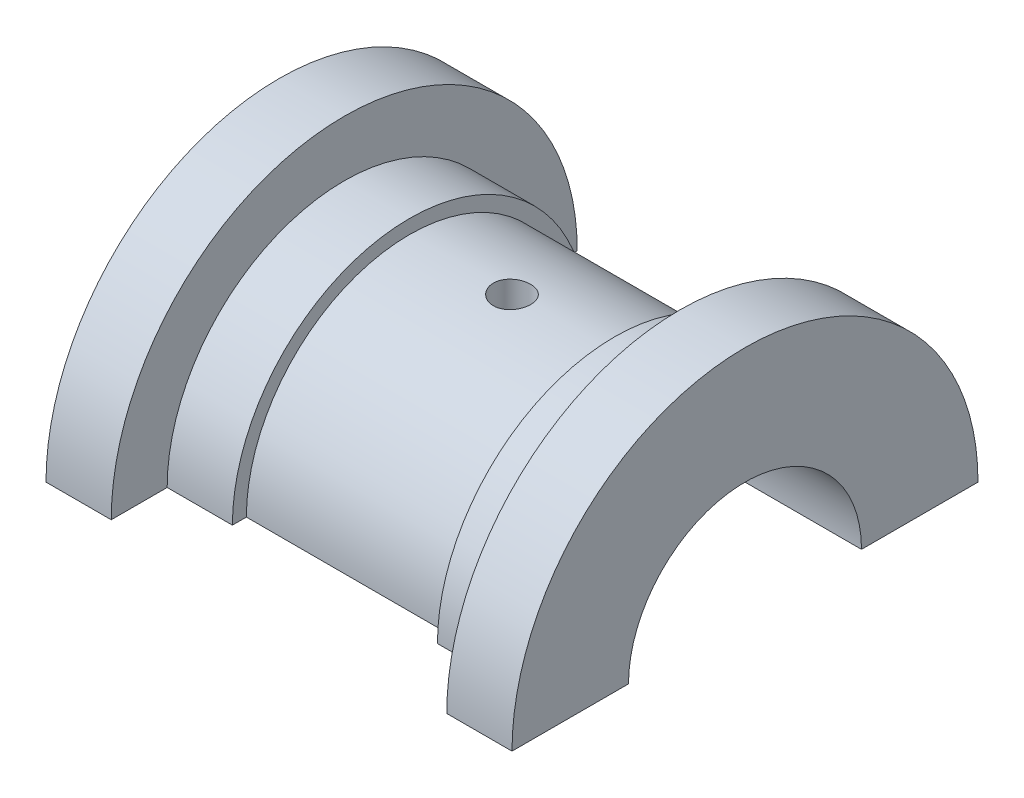
ISO-10303-21;
HEADER;
FILE_DESCRIPTION(('STEP AP214'),'2;1');
FILE_NAME('part.step','',(''),(''),'','','');
FILE_SCHEMA(('AUTOMOTIVE_DESIGN { 1 0 10303 214 1 1 1 1 }'));
ENDSEC;
DATA;
#1=APPLICATION_CONTEXT('core data for automotive mechanical design processes');
#2=APPLICATION_PROTOCOL_DEFINITION('international standard','automotive_design',2000,#1);
#3=PRODUCT_CONTEXT('',#1,'mechanical');
#4=PRODUCT('Part','Part','',(#3));
#5=PRODUCT_RELATED_PRODUCT_CATEGORY('part','',(#4));
#6=PRODUCT_DEFINITION_FORMATION('','',#4);
#7=PRODUCT_DEFINITION_CONTEXT('part definition',#1,'design');
#8=PRODUCT_DEFINITION('design','',#6,#7);
#9=PRODUCT_DEFINITION_SHAPE('','',#8);
#10=(LENGTH_UNIT() NAMED_UNIT(*) SI_UNIT(.MILLI.,.METRE.));
#11=(NAMED_UNIT(*) PLANE_ANGLE_UNIT() SI_UNIT($,.RADIAN.));
#12=(NAMED_UNIT(*) SI_UNIT($,.STERADIAN.) SOLID_ANGLE_UNIT());
#13=UNCERTAINTY_MEASURE_WITH_UNIT(LENGTH_MEASURE(1.E-05),#10,'distance_accuracy_value','');
#14=(GEOMETRIC_REPRESENTATION_CONTEXT(3) GLOBAL_UNCERTAINTY_ASSIGNED_CONTEXT((#13)) GLOBAL_UNIT_ASSIGNED_CONTEXT((#10,
#11,#12)) REPRESENTATION_CONTEXT('',''));
#15=CARTESIAN_POINT('',(0.,0.,0.));
#16=DIRECTION('',(0.,0.,1.));
#17=DIRECTION('',(1.,0.,0.));
#18=AXIS2_PLACEMENT_3D('',#15,#16,#17);
#19=CARTESIAN_POINT('',(25.,0.,0.));
#20=DIRECTION('',(-1.,0.,0.));
#21=DIRECTION('',(0.,0.,1.));
#22=AXIS2_PLACEMENT_3D('',#19,#20,#21);
#23=PLANE('',#22);
#24=CARTESIAN_POINT('',(25.,0.,0.));
#25=DIRECTION('',(-1.,0.,0.));
#26=DIRECTION('',(0.,0.,1.));
#27=AXIS2_PLACEMENT_3D('',#24,#25,#26);
#28=CIRCLE('',#27,25.);
#29=CARTESIAN_POINT('',(25.,0.,25.));
#30=VERTEX_POINT('',#29);
#31=CARTESIAN_POINT('',(25.,0.,-25.));
#32=VERTEX_POINT('',#31);
#33=EDGE_CURVE('E151',#30,#32,#28,.T.);
#34=ORIENTED_EDGE('',*,*,#33,.F.);
#35=DIRECTION('',(0.,0.,-1.));
#36=VECTOR('',#35,1.);
#37=CARTESIAN_POINT('',(25.,0.,0.));
#38=LINE('',#37,#36);
#39=CARTESIAN_POINT('',(25.,0.,12.5));
#40=VERTEX_POINT('',#39);
#41=EDGE_CURVE('E156',#30,#40,#38,.T.);
#42=ORIENTED_EDGE('',*,*,#41,.T.);
#43=CARTESIAN_POINT('',(25.,0.,0.));
#44=DIRECTION('',(1.,0.,0.));
#45=DIRECTION('',(0.,0.,-1.));
#46=AXIS2_PLACEMENT_3D('',#43,#44,#45);
#47=CIRCLE('',#46,12.5);
#48=CARTESIAN_POINT('',(25.,0.,-12.5));
#49=VERTEX_POINT('',#48);
#50=EDGE_CURVE('E153',#49,#40,#47,.T.);
#51=ORIENTED_EDGE('',*,*,#50,.F.);
#52=EDGE_CURVE('E64',#49,#32,#38,.T.);
#53=ORIENTED_EDGE('',*,*,#52,.T.);
#54=EDGE_LOOP('',(#34,#42,#51,#53));
#55=FACE_BOUND('',#54,.T.);
#56=ADVANCED_FACE('F43',(#55),#23,.F.);
#57=CARTESIAN_POINT('',(-25.,0.,0.));
#58=DIRECTION('',(-1.,0.,0.));
#59=DIRECTION('',(0.,0.,1.));
#60=AXIS2_PLACEMENT_3D('',#57,#58,#59);
#61=CYLINDRICAL_SURFACE('',#60,25.);
#62=ORIENTED_EDGE('',*,*,#33,.T.);
#63=DIRECTION('',(-1.,0.,0.));
#64=VECTOR('',#63,1.);
#65=CARTESIAN_POINT('',(133.253175473055,0.,-25.));
#66=LINE('',#65,#64);
#67=CARTESIAN_POINT('',(18.,0.,-25.));
#68=VERTEX_POINT('',#67);
#69=EDGE_CURVE('E135',#32,#68,#66,.T.);
#70=ORIENTED_EDGE('',*,*,#69,.T.);
#71=CARTESIAN_POINT('',(18.,0.,0.));
#72=DIRECTION('',(-1.,0.,0.));
#73=DIRECTION('',(0.,0.,1.));
#74=AXIS2_PLACEMENT_3D('',#71,#72,#73);
#75=CIRCLE('',#74,25.);
#76=CARTESIAN_POINT('',(18.,0.,25.));
#77=VERTEX_POINT('',#76);
#78=EDGE_CURVE('E161',#77,#68,#75,.T.);
#79=ORIENTED_EDGE('',*,*,#78,.F.);
#80=DIRECTION('',(-1.,0.,0.));
#81=VECTOR('',#80,1.);
#82=CARTESIAN_POINT('',(133.253175473055,0.,25.));
#83=LINE('',#82,#81);
#84=EDGE_CURVE('E159',#30,#77,#83,.T.);
#85=ORIENTED_EDGE('',*,*,#84,.F.);
#86=EDGE_LOOP('',(#62,#70,#79,#85));
#87=FACE_BOUND('',#86,.T.);
#88=ADVANCED_FACE('F158',(#87),#61,.T.);
#89=CARTESIAN_POINT('',(18.,25.,0.));
#90=DIRECTION('',(1.,0.,0.));
#91=DIRECTION('',(0.,0.,-1.));
#92=AXIS2_PLACEMENT_3D('',#89,#90,#91);
#93=PLANE('',#92);
#94=ORIENTED_EDGE('',*,*,#78,.T.);
#95=DIRECTION('',(0.,0.,1.));
#96=VECTOR('',#95,1.);
#97=CARTESIAN_POINT('',(18.,0.,0.));
#98=LINE('',#97,#96);
#99=CARTESIAN_POINT('',(18.,0.,-19.));
#100=VERTEX_POINT('',#99);
#101=EDGE_CURVE('E138',#68,#100,#98,.T.);
#102=ORIENTED_EDGE('',*,*,#101,.T.);
#103=CARTESIAN_POINT('',(18.,0.,0.));
#104=DIRECTION('',(-1.,0.,0.));
#105=DIRECTION('',(0.,0.,1.));
#106=AXIS2_PLACEMENT_3D('',#103,#104,#105);
#107=CIRCLE('',#106,19.);
#108=CARTESIAN_POINT('',(18.,0.,19.));
#109=VERTEX_POINT('',#108);
#110=EDGE_CURVE('E166',#109,#100,#107,.T.);
#111=ORIENTED_EDGE('',*,*,#110,.F.);
#112=EDGE_CURVE('E203',#109,#77,#98,.T.);
#113=ORIENTED_EDGE('',*,*,#112,.T.);
#114=EDGE_LOOP('',(#94,#102,#111,#113));
#115=FACE_BOUND('',#114,.T.);
#116=ADVANCED_FACE('F308',(#115),#93,.F.);
#117=CARTESIAN_POINT('',(-25.,0.,0.));
#118=DIRECTION('',(-1.,0.,0.));
#119=DIRECTION('',(0.,0.,1.));
#120=AXIS2_PLACEMENT_3D('',#117,#118,#119);
#121=CYLINDRICAL_SURFACE('',#120,19.);
#122=ORIENTED_EDGE('',*,*,#110,.T.);
#123=DIRECTION('',(-1.,0.,0.));
#124=VECTOR('',#123,1.);
#125=CARTESIAN_POINT('',(-25.,0.,-19.));
#126=LINE('',#125,#124);
#127=CARTESIAN_POINT('',(11.,0.,-19.));
#128=VERTEX_POINT('',#127);
#129=EDGE_CURVE('E224',#100,#128,#126,.T.);
#130=ORIENTED_EDGE('',*,*,#129,.T.);
#131=CARTESIAN_POINT('',(11.,0.,0.));
#132=DIRECTION('',(-1.,0.,0.));
#133=DIRECTION('',(0.,0.,1.));
#134=AXIS2_PLACEMENT_3D('',#131,#132,#133);
#135=CIRCLE('',#134,19.);
#136=CARTESIAN_POINT('',(11.,0.,19.));
#137=VERTEX_POINT('',#136);
#138=EDGE_CURVE('E172',#137,#128,#135,.T.);
#139=ORIENTED_EDGE('',*,*,#138,.F.);
#140=DIRECTION('',(-1.,0.,0.));
#141=VECTOR('',#140,1.);
#142=CARTESIAN_POINT('',(-25.,0.,19.));
#143=LINE('',#142,#141);
#144=EDGE_CURVE('E207',#137,#109,#143,.F.);
#145=ORIENTED_EDGE('',*,*,#144,.T.);
#146=EDGE_LOOP('',(#122,#130,#139,#145));
#147=FACE_BOUND('',#146,.T.);
#148=ADVANCED_FACE('F312',(#147),#121,.T.);
#149=CARTESIAN_POINT('',(11.,19.,0.));
#150=DIRECTION('',(1.,0.,0.));
#151=DIRECTION('',(0.,0.,-1.));
#152=AXIS2_PLACEMENT_3D('',#149,#150,#151);
#153=PLANE('',#152);
#154=ORIENTED_EDGE('',*,*,#138,.T.);
#155=DIRECTION('',(0.,0.,1.));
#156=VECTOR('',#155,1.);
#157=CARTESIAN_POINT('',(11.,0.,0.));
#158=LINE('',#157,#156);
#159=CARTESIAN_POINT('',(11.,0.,-17.5));
#160=VERTEX_POINT('',#159);
#161=EDGE_CURVE('E228',#128,#160,#158,.T.);
#162=ORIENTED_EDGE('',*,*,#161,.T.);
#163=CARTESIAN_POINT('',(11.,0.,0.));
#164=DIRECTION('',(-1.,0.,0.));
#165=DIRECTION('',(0.,0.,1.));
#166=AXIS2_PLACEMENT_3D('',#163,#164,#165);
#167=CIRCLE('',#166,17.5);
#168=CARTESIAN_POINT('',(11.,0.,17.5));
#169=VERTEX_POINT('',#168);
#170=EDGE_CURVE('E176',#169,#160,#167,.T.);
#171=ORIENTED_EDGE('',*,*,#170,.F.);
#172=EDGE_CURVE('E211',#169,#137,#158,.T.);
#173=ORIENTED_EDGE('',*,*,#172,.T.);
#174=EDGE_LOOP('',(#154,#162,#171,#173));
#175=FACE_BOUND('',#174,.T.);
#176=ADVANCED_FACE('F301',(#175),#153,.F.);
#177=CARTESIAN_POINT('',(-25.,0.,0.));
#178=DIRECTION('',(-1.,0.,0.));
#179=DIRECTION('',(0.,0.,1.));
#180=AXIS2_PLACEMENT_3D('',#177,#178,#179);
#181=CYLINDRICAL_SURFACE('',#180,17.5);
#182=CARTESIAN_POINT('',(0.,17.3853386507137,2.));
#183=CARTESIAN_POINT('',(-0.111946589372524,17.3853401353315,1.99999519733595));
#184=CARTESIAN_POINT('',(-0.223964994921923,17.3864315751054,1.99056928251642));
#185=CARTESIAN_POINT('',(-0.444889671697474,17.3906782331753,1.95311344773096));
#186=CARTESIAN_POINT('',(-0.553792479503965,17.3938356616542,1.92506360351944));
#187=CARTESIAN_POINT('',(-0.765255030279527,17.4018520931882,1.85119296589626));
#188=CARTESIAN_POINT('',(-0.867818819285594,17.4067099973959,1.80538364660709));
#189=CARTESIAN_POINT('',(-1.06378206604588,17.4175786814491,1.6973178849601));
#190=CARTESIAN_POINT('',(-1.15718320126785,17.423589249671,1.6350644608687));
#191=CARTESIAN_POINT('',(-1.33262956371172,17.4361176819346,1.49556368835386));
#192=CARTESIAN_POINT('',(-1.41462552791579,17.4426375676046,1.41825455823809));
#193=CARTESIAN_POINT('',(-1.56450902249383,17.4554317583341,1.25096954824277));
#194=CARTESIAN_POINT('',(-1.63239587710581,17.4617060516193,1.16099306200071));
#195=CARTESIAN_POINT('',(-1.75230824059131,17.4733225280882,0.970620910263634));
#196=CARTESIAN_POINT('',(-1.80428955803743,17.4786620969871,0.870197236204717));
#197=CARTESIAN_POINT('',(-1.89063240605875,17.4877853680334,0.66197497320992));
#198=CARTESIAN_POINT('',(-1.9249944880326,17.4915691188697,0.554176615186415));
#199=CARTESIAN_POINT('',(-1.97497734252851,17.4971402074226,0.334766558288024));
#200=CARTESIAN_POINT('',(-1.99067964857446,17.4989362281041,0.223173657194599));
#201=CARTESIAN_POINT('',(-2.00314972142082,17.5003590938998,-0.00107691382555879));
#202=CARTESIAN_POINT('',(-1.99991811760643,17.4999860111176,-0.11373454823503));
#203=CARTESIAN_POINT('',(-1.9746778272773,17.497119767547,-0.33636248784968));
#204=CARTESIAN_POINT('',(-1.95275682041612,17.4946365066491,-0.44634287900327));
#205=CARTESIAN_POINT('',(-1.89089682950376,17.487840154992,-0.661053445479786));
#206=CARTESIAN_POINT('',(-1.85095755129325,17.4835270343592,-0.765783535057301));
#207=CARTESIAN_POINT('',(-1.75410019097594,17.4735386514763,-0.967294288035754));
#208=CARTESIAN_POINT('',(-1.69714377600709,17.4678603196472,-1.06405636819045));
#209=CARTESIAN_POINT('',(-1.56789678444337,17.4557776619181,-1.24668163917683));
#210=CARTESIAN_POINT('',(-1.49560561983236,17.449373308183,-1.33254441186903));
#211=CARTESIAN_POINT('',(-1.33724919448781,17.436513040988,-1.49144815236604));
#212=CARTESIAN_POINT('',(-1.25110758210007,17.4300570420279,-1.56441304576845));
#213=CARTESIAN_POINT('',(-1.0677588923309,17.4178574111694,-1.69485961446738));
#214=CARTESIAN_POINT('',(-0.970551789715113,17.4121137808956,-1.75234125445402));
#215=CARTESIAN_POINT('',(-0.767767939743451,17.4019890438088,-1.85019181534949));
#216=CARTESIAN_POINT('',(-0.662188535919722,17.3976083716403,-1.89055527879404));
#217=CARTESIAN_POINT('',(-0.445689423466888,17.3907142897617,-1.95295957446188));
#218=CARTESIAN_POINT('',(-0.334769928945008,17.3882008052541,-1.97500114064275));
#219=CARTESIAN_POINT('',(-0.111409276007052,17.3853390699854,-2.00003653434785));
#220=CARTESIAN_POINT('',(0.00101976549901365,17.384978682311,-2.00313713351255));
#221=CARTESIAN_POINT('',(0.224795725911944,17.3864318824203,-1.99048370024868));
#222=CARTESIAN_POINT('',(0.336142663982754,17.3882454316329,-1.97473000234356));
#223=CARTESIAN_POINT('',(0.554277710431836,17.3938311078367,-1.92490480743124));
#224=CARTESIAN_POINT('',(0.661077653557209,17.3975977651037,-1.89088445720912));
#225=CARTESIAN_POINT('',(0.867456208856068,17.4066608217964,-1.8055441206904));
#226=CARTESIAN_POINT('',(0.96703460698983,17.4119572665405,-1.75422362188829));
#227=CARTESIAN_POINT('',(1.15662812006314,17.4235123453982,-1.63547501760195));
#228=CARTESIAN_POINT('',(1.24659891285623,17.4297751382952,-1.56797655870491));
#229=CARTESIAN_POINT('',(1.41397230825862,17.442543959092,-1.41888814821184));
#230=CARTESIAN_POINT('',(1.49137450327603,17.4490499948718,-1.33729773979956));
#231=CARTESIAN_POINT('',(1.63178548317454,17.4616092377758,-1.16187651855541));
#232=CARTESIAN_POINT('',(1.69472433770165,17.4676601534551,-1.06798954470542));
#233=CARTESIAN_POINT('',(1.80393937919364,17.4785935486018,-0.87091535139036));
#234=CARTESIAN_POINT('',(1.8502158540187,17.4834760482544,-0.767728292632569));
#235=CARTESIAN_POINT('',(1.92467566123987,17.4915122431867,-0.555220730050709));
#236=CARTESIAN_POINT('',(1.95290023506191,17.4946698766728,-0.445914831710694));
#237=CARTESIAN_POINT('',(1.99058941951927,17.498916830849,-0.224077216219368));
#238=CARTESIAN_POINT('',(2.00005473054384,17.5000062287579,-0.111545619660738));
#239=CARTESIAN_POINT('',(1.99994510250234,17.4999937520126,0.112864401253134));
#240=CARTESIAN_POINT('',(1.99047832045056,17.4989043247502,0.22474289469505));
#241=CARTESIAN_POINT('',(1.95300127134245,17.4946812487719,0.445308378800855));
#242=CARTESIAN_POINT('',(1.92499100344009,17.4915475999627,0.553995369319135));
#243=CARTESIAN_POINT('',(1.85125428527817,17.4835868311737,0.765084431079245));
#244=CARTESIAN_POINT('',(1.80553211653411,17.478760120486,0.867488014290727));
#245=CARTESIAN_POINT('',(1.69768073352085,17.4679493137143,1.0631853726956));
#246=CARTESIAN_POINT('',(1.63555145524283,17.4619652131149,1.15647911234695));
#247=CARTESIAN_POINT('',(1.49624648821104,17.4494678477128,1.33186210611053));
#248=CARTESIAN_POINT('',(1.41899021819487,17.4429518630308,1.41388716420689));
#249=CARTESIAN_POINT('',(1.25178901681435,17.4301475365176,1.5638533009412));
#250=CARTESIAN_POINT('',(1.16184106815131,17.4238592492669,1.63179102096622));
#251=CARTESIAN_POINT('',(0.971480376349264,17.4122005213082,1.75183717616198));
#252=CARTESIAN_POINT('',(0.871034600637649,17.4068331273112,1.80389349456594));
#253=CARTESIAN_POINT('',(0.662825662631923,17.3976597913728,1.89032803888977));
#254=CARTESIAN_POINT('',(0.555070743865214,17.3938521233529,1.92472581745879));
#255=CARTESIAN_POINT('',(0.372277873121076,17.3891702575432,1.96647476380521));
#256=CARTESIAN_POINT('',(0.298400454831266,17.3877403947785,1.9790290620281));
#257=CARTESIAN_POINT('',(0.149692726088288,17.3858240977585,1.99579326119775));
#258=CARTESIAN_POINT('',(0.0748624212969904,17.3853376579002,2.00000321170177));
#259=CARTESIAN_POINT('',(0.,17.3853386507137,2.));
#260=B_SPLINE_CURVE_WITH_KNOTS('',3,(#182,#183,#184,#185,#186,#187,#188,#189,#190,#191,#192,
#193,#194,#195,#196,#197,#198,#199,#200,#201,#202,#203,#204,#205,#206,#207,#208,#209,#210,#211,
#212,#213,#214,#215,#216,#217,#218,#219,#220,#221,#222,#223,#224,#225,#226,#227,#228,#229,#230,
#231,#232,#233,#234,#235,#236,#237,#238,#239,#240,#241,#242,#243,#244,#245,#246,#247,#248,#249,
#250,#251,#252,#253,#254,#255,#256,#257,#258,#259),.UNSPECIFIED.,.T.,.F.,(4,2,2,2,2,2,2,2,2,2,2,
2,2,2,2,2,2,2,2,2,2,2,2,2,2,2,2,2,2,2,2,2,2,2,2,2,2,2,4),(0.,0.335566330669862,
0.671492236482426,1.00720146648589,1.34284912082551,1.67990430025881,2.01697561937898,
2.35497511648652,2.69296403516427,3.02947062308711,3.36596602520247,3.70089142156129,
4.03582228598058,4.3715133792636,4.70721734706225,5.04483970261994,5.3824628281258,
5.72019351085555,6.05791066376697,6.39372230997641,6.72952799811684,7.06439829362762,
7.3992785103225,7.73564232927687,8.07201705412561,8.40998545131677,8.74794800946722,
9.08513567305447,9.42231074728433,9.75756507912587,10.0928194262631,10.4279927825518,
10.7631674464669,11.1001786972192,11.4372702038874,11.7754563049136,12.113267132881,
12.3376728727777,12.5620772799195),.UNSPECIFIED.);
#261=CARTESIAN_POINT('',(0.,17.3853386507137,2.));
#262=VERTEX_POINT('',#261);
#263=EDGE_CURVE('E253',#262,#262,#260,.T.);
#264=ORIENTED_EDGE('',*,*,#263,.T.);
#265=EDGE_LOOP('',(#264));
#266=FACE_BOUND('',#265,.T.);
#267=ORIENTED_EDGE('',*,*,#170,.T.);
#268=DIRECTION('',(-1.,0.,0.));
#269=VECTOR('',#268,1.);
#270=CARTESIAN_POINT('',(-25.,0.,-17.5));
#271=LINE('',#270,#269);
#272=CARTESIAN_POINT('',(-11.,0.,-17.5));
#273=VERTEX_POINT('',#272);
#274=EDGE_CURVE('E232',#160,#273,#271,.T.);
#275=ORIENTED_EDGE('',*,*,#274,.T.);
#276=CARTESIAN_POINT('',(-11.,0.,0.));
#277=DIRECTION('',(-1.,0.,0.));
#278=DIRECTION('',(0.,0.,1.));
#279=AXIS2_PLACEMENT_3D('',#276,#277,#278);
#280=CIRCLE('',#279,17.5);
#281=CARTESIAN_POINT('',(-11.,0.,17.5));
#282=VERTEX_POINT('',#281);
#283=EDGE_CURVE('E180',#282,#273,#280,.T.);
#284=ORIENTED_EDGE('',*,*,#283,.F.);
#285=DIRECTION('',(-1.,0.,0.));
#286=VECTOR('',#285,1.);
#287=CARTESIAN_POINT('',(-25.,0.,17.5));
#288=LINE('',#287,#286);
#289=EDGE_CURVE('E212',#282,#169,#288,.F.);
#290=ORIENTED_EDGE('',*,*,#289,.T.);
#291=EDGE_LOOP('',(#267,#275,#284,#290));
#292=FACE_BOUND('',#291,.T.);
#293=ADVANCED_FACE('F263',(#266,#292),#181,.T.);
#294=CARTESIAN_POINT('',(-11.,19.,0.));
#295=DIRECTION('',(-1.,0.,0.));
#296=DIRECTION('',(0.,0.,1.));
#297=AXIS2_PLACEMENT_3D('',#294,#295,#296);
#298=PLANE('',#297);
#299=CARTESIAN_POINT('',(-11.,0.,0.));
#300=DIRECTION('',(-1.,0.,0.));
#301=DIRECTION('',(0.,0.,1.));
#302=AXIS2_PLACEMENT_3D('',#299,#300,#301);
#303=CIRCLE('',#302,19.);
#304=CARTESIAN_POINT('',(-11.,0.,19.));
#305=VERTEX_POINT('',#304);
#306=CARTESIAN_POINT('',(-11.,0.,-19.));
#307=VERTEX_POINT('',#306);
#308=EDGE_CURVE('E184',#305,#307,#303,.T.);
#309=ORIENTED_EDGE('',*,*,#308,.F.);
#310=DIRECTION('',(0.,0.,-1.));
#311=VECTOR('',#310,1.);
#312=CARTESIAN_POINT('',(-11.,0.,0.));
#313=LINE('',#312,#311);
#314=EDGE_CURVE('E216',#305,#282,#313,.T.);
#315=ORIENTED_EDGE('',*,*,#314,.T.);
#316=ORIENTED_EDGE('',*,*,#283,.T.);
#317=EDGE_CURVE('E236',#273,#307,#313,.T.);
#318=ORIENTED_EDGE('',*,*,#317,.T.);
#319=EDGE_LOOP('',(#309,#315,#316,#318));
#320=FACE_BOUND('',#319,.T.);
#321=ADVANCED_FACE('F294',(#320),#298,.F.);
#322=CARTESIAN_POINT('',(-25.,0.,0.));
#323=DIRECTION('',(-1.,0.,0.));
#324=DIRECTION('',(0.,0.,1.));
#325=AXIS2_PLACEMENT_3D('',#322,#323,#324);
#326=CYLINDRICAL_SURFACE('',#325,19.);
#327=ORIENTED_EDGE('',*,*,#308,.T.);
#328=DIRECTION('',(-1.,0.,0.));
#329=VECTOR('',#328,1.);
#330=CARTESIAN_POINT('',(-25.,0.,-19.));
#331=LINE('',#330,#329);
#332=CARTESIAN_POINT('',(-18.,0.,-19.));
#333=VERTEX_POINT('',#332);
#334=EDGE_CURVE('E240',#307,#333,#331,.T.);
#335=ORIENTED_EDGE('',*,*,#334,.T.);
#336=CARTESIAN_POINT('',(-18.,0.,0.));
#337=DIRECTION('',(-1.,0.,0.));
#338=DIRECTION('',(0.,0.,1.));
#339=AXIS2_PLACEMENT_3D('',#336,#337,#338);
#340=CIRCLE('',#339,19.);
#341=CARTESIAN_POINT('',(-18.,0.,19.));
#342=VERTEX_POINT('',#341);
#343=EDGE_CURVE('E188',#342,#333,#340,.T.);
#344=ORIENTED_EDGE('',*,*,#343,.F.);
#345=DIRECTION('',(-1.,0.,0.));
#346=VECTOR('',#345,1.);
#347=CARTESIAN_POINT('',(-25.,0.,19.));
#348=LINE('',#347,#346);
#349=EDGE_CURVE('E217',#342,#305,#348,.F.);
#350=ORIENTED_EDGE('',*,*,#349,.T.);
#351=EDGE_LOOP('',(#327,#335,#344,#350));
#352=FACE_BOUND('',#351,.T.);
#353=ADVANCED_FACE('F291',(#352),#326,.T.);
#354=CARTESIAN_POINT('',(-18.,25.,0.));
#355=DIRECTION('',(-1.,0.,0.));
#356=DIRECTION('',(0.,0.,1.));
#357=AXIS2_PLACEMENT_3D('',#354,#355,#356);
#358=PLANE('',#357);
#359=CARTESIAN_POINT('',(-18.,0.,0.));
#360=DIRECTION('',(-1.,0.,0.));
#361=DIRECTION('',(0.,0.,1.));
#362=AXIS2_PLACEMENT_3D('',#359,#360,#361);
#363=CIRCLE('',#362,25.);
#364=CARTESIAN_POINT('',(-18.,0.,25.));
#365=VERTEX_POINT('',#364);
#366=CARTESIAN_POINT('',(-18.,0.,-25.));
#367=VERTEX_POINT('',#366);
#368=EDGE_CURVE('E192',#365,#367,#363,.T.);
#369=ORIENTED_EDGE('',*,*,#368,.F.);
#370=DIRECTION('',(0.,0.,-1.));
#371=VECTOR('',#370,1.);
#372=CARTESIAN_POINT('',(-18.,0.,0.));
#373=LINE('',#372,#371);
#374=EDGE_CURVE('E221',#365,#342,#373,.T.);
#375=ORIENTED_EDGE('',*,*,#374,.T.);
#376=ORIENTED_EDGE('',*,*,#343,.T.);
#377=EDGE_CURVE('E244',#333,#367,#373,.T.);
#378=ORIENTED_EDGE('',*,*,#377,.T.);
#379=EDGE_LOOP('',(#369,#375,#376,#378));
#380=FACE_BOUND('',#379,.T.);
#381=ADVANCED_FACE('F287',(#380),#358,.F.);
#382=CARTESIAN_POINT('',(-25.,0.,0.));
#383=DIRECTION('',(-1.,0.,0.));
#384=DIRECTION('',(0.,0.,1.));
#385=AXIS2_PLACEMENT_3D('',#382,#383,#384);
#386=CYLINDRICAL_SURFACE('',#385,25.);
#387=ORIENTED_EDGE('',*,*,#368,.T.);
#388=CARTESIAN_POINT('',(-25.,0.,-25.));
#389=VERTEX_POINT('',#388);
#390=EDGE_CURVE('E145',#367,#389,#66,.T.);
#391=ORIENTED_EDGE('',*,*,#390,.T.);
#392=CARTESIAN_POINT('',(-25.,0.,0.));
#393=DIRECTION('',(-1.,0.,0.));
#394=DIRECTION('',(0.,0.,1.));
#395=AXIS2_PLACEMENT_3D('',#392,#393,#394);
#396=CIRCLE('',#395,25.);
#397=CARTESIAN_POINT('',(-25.,0.,25.));
#398=VERTEX_POINT('',#397);
#399=EDGE_CURVE('E196',#398,#389,#396,.T.);
#400=ORIENTED_EDGE('',*,*,#399,.F.);
#401=EDGE_CURVE('E251',#365,#398,#83,.T.);
#402=ORIENTED_EDGE('',*,*,#401,.F.);
#403=EDGE_LOOP('',(#387,#391,#400,#402));
#404=FACE_BOUND('',#403,.T.);
#405=ADVANCED_FACE('F283',(#404),#386,.T.);
#406=CARTESIAN_POINT('',(-25.,0.,0.));
#407=DIRECTION('',(1.,0.,0.));
#408=DIRECTION('',(0.,0.,-1.));
#409=AXIS2_PLACEMENT_3D('',#406,#407,#408);
#410=PLANE('',#409);
#411=ORIENTED_EDGE('',*,*,#399,.T.);
#412=DIRECTION('',(0.,0.,1.));
#413=VECTOR('',#412,1.);
#414=CARTESIAN_POINT('',(-25.,0.,0.));
#415=LINE('',#414,#413);
#416=CARTESIAN_POINT('',(-25.,0.,-12.5));
#417=VERTEX_POINT('',#416);
#418=EDGE_CURVE('E144',#389,#417,#415,.T.);
#419=ORIENTED_EDGE('',*,*,#418,.T.);
#420=CARTESIAN_POINT('',(-25.,0.,0.));
#421=DIRECTION('',(1.,0.,0.));
#422=DIRECTION('',(0.,0.,-1.));
#423=AXIS2_PLACEMENT_3D('',#420,#421,#422);
#424=CIRCLE('',#423,12.5);
#425=CARTESIAN_POINT('',(-25.,0.,12.5));
#426=VERTEX_POINT('',#425);
#427=EDGE_CURVE('E200',#417,#426,#424,.T.);
#428=ORIENTED_EDGE('',*,*,#427,.T.);
#429=EDGE_CURVE('E72',#426,#398,#415,.T.);
#430=ORIENTED_EDGE('',*,*,#429,.T.);
#431=EDGE_LOOP('',(#411,#419,#428,#430));
#432=FACE_BOUND('',#431,.T.);
#433=ADVANCED_FACE('F279',(#432),#410,.F.);
#434=CARTESIAN_POINT('',(-25.,0.,0.));
#435=DIRECTION('',(1.,0.,0.));
#436=DIRECTION('',(0.,0.,-1.));
#437=AXIS2_PLACEMENT_3D('',#434,#435,#436);
#438=CYLINDRICAL_SURFACE('',#437,12.5);
#439=CARTESIAN_POINT('',(0.,12.3389626792531,2.));
#440=CARTESIAN_POINT('',(0.111566715369601,12.3389646365747,1.99999546268269));
#441=CARTESIAN_POINT('',(0.223195940876381,12.3404922170901,1.99063305520351));
#442=CARTESIAN_POINT('',(0.443326847344627,12.3464325117521,1.95344445500885));
#443=CARTESIAN_POINT('',(0.551825474504615,12.3508479497636,1.92560083019994));
#444=CARTESIAN_POINT('',(0.762477313101267,12.3620513503607,1.85230972937127));
#445=CARTESIAN_POINT('',(0.864635571645263,12.3688373965941,1.8068764692589));
#446=CARTESIAN_POINT('',(1.05986648038844,12.3840151290006,1.6997304164843));
#447=CARTESIAN_POINT('',(1.15294024493589,12.3924066178675,1.63801962395042));
#448=CARTESIAN_POINT('',(1.32821893279529,12.409935008592,1.49947140236479));
#449=CARTESIAN_POINT('',(1.41032926550982,12.4190774196954,1.42251498707585));
#450=CARTESIAN_POINT('',(1.56052945966013,12.4370285016078,1.25591709815232));
#451=CARTESIAN_POINT('',(1.62861851530075,12.4458371532121,1.16627489597169));
#452=CARTESIAN_POINT('',(1.7491959612917,12.4621862608068,0.976239917029318));
#453=CARTESIAN_POINT('',(1.80159669033811,12.4697194921289,0.875790844473845));
#454=CARTESIAN_POINT('',(1.88874693905998,12.4826077762261,0.667375995890959));
#455=CARTESIAN_POINT('',(1.92349751749068,12.4879629596488,0.559410671172466));
#456=CARTESIAN_POINT('',(1.97407274436243,12.4958528816707,0.340004128946068));
#457=CARTESIAN_POINT('',(1.99005611940511,12.49841126176,0.228600363359408));
#458=CARTESIAN_POINT('',(2.00313650808571,12.500500461766,0.00466480752225232));
#459=CARTESIAN_POINT('',(2.00023470914493,12.5000314720312,-0.10786691136301));
#460=CARTESIAN_POINT('',(1.97575151431498,12.4961375614702,-0.329779715978531));
#461=CARTESIAN_POINT('',(1.95434091575268,12.4927396690852,-0.439180187321414));
#462=CARTESIAN_POINT('',(1.89371648537535,12.4833998597574,-0.652815342747673));
#463=CARTESIAN_POINT('',(1.85450214519059,12.4774578701704,-0.757049879228181));
#464=CARTESIAN_POINT('',(1.75921154129989,12.4636513003451,-0.957905986409038));
#465=CARTESIAN_POINT('',(1.70306427260419,12.4557786507463,-1.05449329349384));
#466=CARTESIAN_POINT('',(1.57555357138301,12.4389865614945,-1.23693967157033));
#467=CARTESIAN_POINT('',(1.50418900182922,12.4300670436423,-1.32279794013346));
#468=CARTESIAN_POINT('',(1.34732043643976,12.4120565702159,-1.48235721573536));
#469=CARTESIAN_POINT('',(1.2616672241591,12.4029648129688,-1.555911508216));
#470=CARTESIAN_POINT('',(1.07915724372807,12.3857313850728,-1.68762680827441));
#471=CARTESIAN_POINT('',(0.982300387310595,12.3775897219101,-1.74578769456446));
#472=CARTESIAN_POINT('',(0.779969490042988,12.3631781549851,-1.84509031627292));
#473=CARTESIAN_POINT('',(0.674487164843649,12.3569100782548,-1.88621545421918));
#474=CARTESIAN_POINT('',(0.457989378356676,12.3469864391895,-1.95012354011945));
#475=CARTESIAN_POINT('',(0.346974364635672,12.343330665898,-1.9729079691951));
#476=CARTESIAN_POINT('',(0.123872177326534,12.3390860491727,-1.99928349997629));
#477=CARTESIAN_POINT('',(0.0118102853156303,12.338463865144,-2.0030832637492));
#478=CARTESIAN_POINT('',(-0.211348966265646,12.3402681873056,-1.99193667548245));
#479=CARTESIAN_POINT('',(-0.322446359912493,12.3426945853421,-1.97699098847046));
#480=CARTESIAN_POINT('',(-0.539866905444395,12.3502919469979,-1.92895527704861));
#481=CARTESIAN_POINT('',(-0.646213923180768,12.3554469800096,-1.89597053344241));
#482=CARTESIAN_POINT('',(-0.85187038701668,12.3679074973821,-1.81290306911356));
#483=CARTESIAN_POINT('',(-0.951179441681864,12.3752131012361,-1.76281939829005));
#484=CARTESIAN_POINT('',(-1.14087239308146,12.3912295180301,-1.64647965217412));
#485=CARTESIAN_POINT('',(-1.23117295357006,12.3999517832886,-1.58008930093855));
#486=CARTESIAN_POINT('',(-1.39942606063674,12.4177848415153,-1.43320604247695));
#487=CARTESIAN_POINT('',(-1.47737780864004,12.426895659562,-1.35271222391417));
#488=CARTESIAN_POINT('',(-1.61947729209286,12.4445842082074,-1.17898475488122));
#489=CARTESIAN_POINT('',(-1.68348622911078,12.4531560233311,-1.08563688229299));
#490=CARTESIAN_POINT('',(-1.7949130459885,12.4687070996718,-0.889391847388558));
#491=CARTESIAN_POINT('',(-1.8423314293228,12.4756864092145,-0.786494974976326));
#492=CARTESIAN_POINT('',(-1.91901272401869,12.4872402999743,-0.57449377709434));
#493=CARTESIAN_POINT('',(-1.94834960623599,12.4918246669271,-0.465416763098579));
#494=CARTESIAN_POINT('',(-1.98827383639251,12.4981133908354,-0.243805255219827));
#495=CARTESIAN_POINT('',(-1.99886260115402,12.4998179654206,-0.131271023257731));
#496=CARTESIAN_POINT('',(-2.00095179807928,12.5001523384762,0.0927181607457113));
#497=CARTESIAN_POINT('',(-1.99266389940292,12.4988162330541,0.204171144782975));
#498=CARTESIAN_POINT('',(-1.95769116172815,12.4932886224694,0.424076331137223));
#499=CARTESIAN_POINT('',(-1.93100640664942,12.4890971303321,0.532528547140255));
#500=CARTESIAN_POINT('',(-1.86007617517217,12.4783277894448,0.743282123112945));
#501=CARTESIAN_POINT('',(-1.81584732795194,12.471752200968,0.845589202324673));
#502=CARTESIAN_POINT('',(-1.71110753962108,12.4569342995937,1.0413631983055));
#503=CARTESIAN_POINT('',(-1.65059592553781,12.4486919178104,1.13482974947654));
#504=CARTESIAN_POINT('',(-1.51425167961562,12.4313454639236,1.31133889146831));
#505=CARTESIAN_POINT('',(-1.4382634970135,12.4222331866072,1.39426053318836));
#506=CARTESIAN_POINT('',(-1.27345013113633,12.4042323453373,1.54625119082762));
#507=CARTESIAN_POINT('',(-1.18462194427879,12.3953438343009,1.61531695647598));
#508=CARTESIAN_POINT('',(-0.995970826081013,12.3787350502446,1.73804191736152));
#509=CARTESIAN_POINT('',(-0.896080549743534,12.3710226983478,1.79159866107389));
#510=CARTESIAN_POINT('',(-0.688641710336669,12.35773272045,1.88109182389773));
#511=CARTESIAN_POINT('',(-0.581101048458822,12.3521529288763,1.91704612842095));
#512=CARTESIAN_POINT('',(-0.394262041879368,12.3450187006154,1.96235985662764));
#513=CARTESIAN_POINT('',(-0.316104706528516,12.3427600761638,1.97645270113688));
#514=CARTESIAN_POINT('',(-0.158642105439383,12.339731381368,1.99527431170452));
#515=CARTESIAN_POINT('',(-0.079336857961894,12.3389612873707,2.00000322655819));
#516=CARTESIAN_POINT('',(0.,12.3389626792531,2.));
#517=B_SPLINE_CURVE_WITH_KNOTS('',3,(#439,#440,#441,#442,#443,#444,#445,#446,#447,#448,#449,
#450,#451,#452,#453,#454,#455,#456,#457,#458,#459,#460,#461,#462,#463,#464,#465,#466,#467,#468,
#469,#470,#471,#472,#473,#474,#475,#476,#477,#478,#479,#480,#481,#482,#483,#484,#485,#486,#487,
#488,#489,#490,#491,#492,#493,#494,#495,#496,#497,#498,#499,#500,#501,#502,#503,#504,#505,#506,
#507,#508,#509,#510,#511,#512,#513,#514,#515,#516),.UNSPECIFIED.,.T.,.F.,(4,2,2,2,2,2,2,2,2,2,2,
2,2,2,2,2,2,2,2,2,2,2,2,2,2,2,2,2,2,2,2,2,2,2,2,2,2,2,4),(0.,0.334410082462096,0.66913604063283,
1.00359203680449,1.33800695527949,1.6751426933581,2.01229780104021,2.35130309503299,
2.69028805118043,3.02638485112864,3.36246051891023,3.69546762348862,4.0284842373816,
4.36291718178071,4.69737512358616,5.03557384337791,5.37377522782555,5.71230534220323,
6.05080811551122,6.3855820633356,6.72034413480418,7.05317297710996,7.38602031604106,
7.7217061792982,8.05741374188326,8.39632425403564,8.73522448035856,9.07272891067331,
9.41020783420237,9.74392117047707,10.0776329844847,10.4110292424998,10.7444392820194,
11.0813822106389,11.4184040861632,11.7576040091322,12.0964585602663,12.3342666441618,
12.5720709491951),.UNSPECIFIED.);
#518=CARTESIAN_POINT('',(0.,12.3389626792531,2.));
#519=VERTEX_POINT('',#518);
#520=EDGE_CURVE('E46',#519,#519,#517,.T.);
#521=ORIENTED_EDGE('',*,*,#520,.T.);
#522=EDGE_LOOP('',(#521));
#523=FACE_BOUND('',#522,.T.);
#524=ORIENTED_EDGE('',*,*,#50,.T.);
#525=DIRECTION('',(1.,0.,0.));
#526=VECTOR('',#525,1.);
#527=CARTESIAN_POINT('',(-25.,0.,12.5));
#528=LINE('',#527,#526);
#529=EDGE_CURVE('E11',#40,#426,#528,.F.);
#530=ORIENTED_EDGE('',*,*,#529,.T.);
#531=ORIENTED_EDGE('',*,*,#427,.F.);
#532=DIRECTION('',(1.,0.,0.));
#533=VECTOR('',#532,1.);
#534=CARTESIAN_POINT('',(-25.,0.,-12.5));
#535=LINE('',#534,#533);
#536=EDGE_CURVE('E57',#417,#49,#535,.T.);
#537=ORIENTED_EDGE('',*,*,#536,.T.);
#538=EDGE_LOOP('',(#524,#530,#531,#537));
#539=FACE_BOUND('',#538,.T.);
#540=ADVANCED_FACE('F275',(#523,#539),#438,.F.);
#541=CARTESIAN_POINT('',(133.253175473055,0.,25.));
#542=DIRECTION('',(0.,1.,0.));
#543=DIRECTION('',(0.,0.,1.));
#544=AXIS2_PLACEMENT_3D('',#541,#542,#543);
#545=PLANE('',#544);
#546=ORIENTED_EDGE('',*,*,#101,.F.);
#547=ORIENTED_EDGE('',*,*,#69,.F.);
#548=ORIENTED_EDGE('',*,*,#52,.F.);
#549=ORIENTED_EDGE('',*,*,#536,.F.);
#550=ORIENTED_EDGE('',*,*,#418,.F.);
#551=ORIENTED_EDGE('',*,*,#390,.F.);
#552=ORIENTED_EDGE('',*,*,#377,.F.);
#553=ORIENTED_EDGE('',*,*,#334,.F.);
#554=ORIENTED_EDGE('',*,*,#317,.F.);
#555=ORIENTED_EDGE('',*,*,#274,.F.);
#556=ORIENTED_EDGE('',*,*,#161,.F.);
#557=ORIENTED_EDGE('',*,*,#129,.F.);
#558=EDGE_LOOP('',(#546,#547,#548,#549,#550,#551,#552,#553,#554,#555,#556,#557));
#559=FACE_BOUND('',#558,.T.);
#560=ADVANCED_FACE('F136',(#559),#545,.F.);
#561=ORIENTED_EDGE('',*,*,#112,.F.);
#562=ORIENTED_EDGE('',*,*,#144,.F.);
#563=ORIENTED_EDGE('',*,*,#172,.F.);
#564=ORIENTED_EDGE('',*,*,#289,.F.);
#565=ORIENTED_EDGE('',*,*,#314,.F.);
#566=ORIENTED_EDGE('',*,*,#349,.F.);
#567=ORIENTED_EDGE('',*,*,#374,.F.);
#568=ORIENTED_EDGE('',*,*,#401,.T.);
#569=ORIENTED_EDGE('',*,*,#429,.F.);
#570=ORIENTED_EDGE('',*,*,#529,.F.);
#571=ORIENTED_EDGE('',*,*,#41,.F.);
#572=ORIENTED_EDGE('',*,*,#84,.T.);
#573=EDGE_LOOP('',(#561,#562,#563,#564,#565,#566,#567,#568,#569,#570,#571,#572));
#574=FACE_BOUND('',#573,.T.);
#575=ADVANCED_FACE('F271',(#574),#545,.F.);
#576=CARTESIAN_POINT('',(0.,0.,0.));
#577=DIRECTION('',(0.,1.,0.));
#578=DIRECTION('',(0.,0.,1.));
#579=AXIS2_PLACEMENT_3D('',#576,#577,#578);
#580=CYLINDRICAL_SURFACE('',#579,2.);
#581=ORIENTED_EDGE('',*,*,#520,.F.);
#582=EDGE_LOOP('',(#581));
#583=FACE_BOUND('',#582,.T.);
#584=ORIENTED_EDGE('',*,*,#263,.F.);
#585=EDGE_LOOP('',(#584));
#586=FACE_BOUND('',#585,.T.);
#587=ADVANCED_FACE('F267',(#583,#586),#580,.F.);
#588=CLOSED_SHELL('',(#56,#88,#116,#148,#176,#293,#321,#353,#381,#405,#433,#540,#560,#575,#587));
#589=MANIFOLD_SOLID_BREP('B2',#588);
#590=ADVANCED_BREP_SHAPE_REPRESENTATION('',(#18,#589),#14);
#591=SHAPE_DEFINITION_REPRESENTATION(#9,#590);
ENDSEC;
END-ISO-10303-21;
